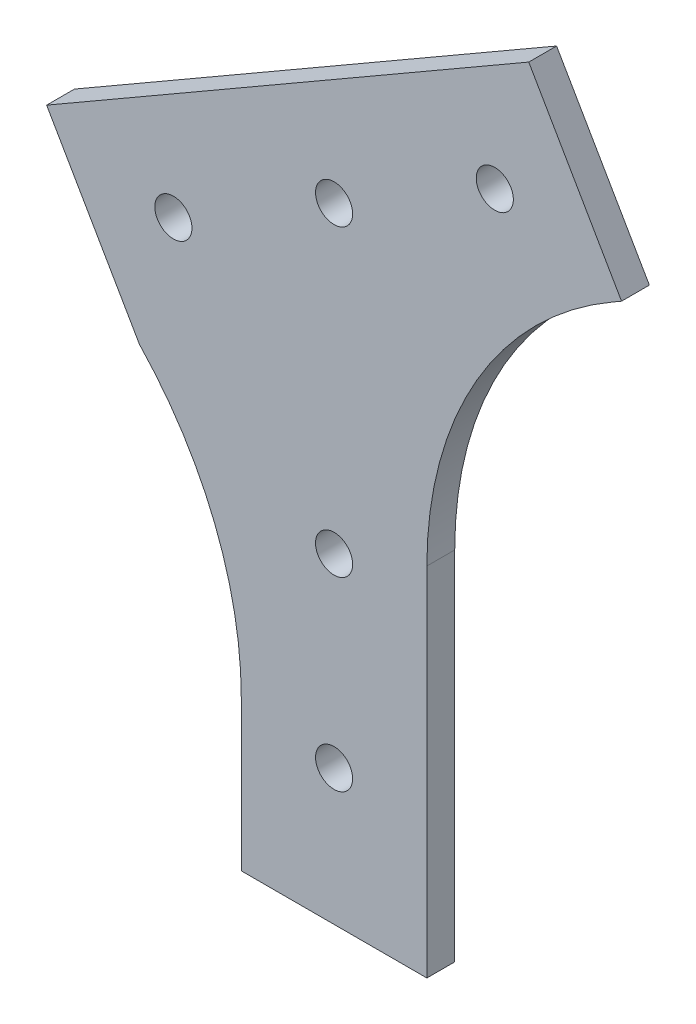
ISO-10303-21;
HEADER;
FILE_DESCRIPTION(('STEP AP214'),'2;1');
FILE_NAME('part.step','',(''),(''),'','','');
FILE_SCHEMA(('AUTOMOTIVE_DESIGN { 1 0 10303 214 1 1 1 1 }'));
ENDSEC;
DATA;
#1=APPLICATION_CONTEXT('core data for automotive mechanical design processes');
#2=APPLICATION_PROTOCOL_DEFINITION('international standard','automotive_design',2000,#1);
#3=PRODUCT_CONTEXT('',#1,'mechanical');
#4=PRODUCT('Part','Part','',(#3));
#5=PRODUCT_RELATED_PRODUCT_CATEGORY('part','',(#4));
#6=PRODUCT_DEFINITION_FORMATION('','',#4);
#7=PRODUCT_DEFINITION_CONTEXT('part definition',#1,'design');
#8=PRODUCT_DEFINITION('design','',#6,#7);
#9=PRODUCT_DEFINITION_SHAPE('','',#8);
#10=(LENGTH_UNIT() NAMED_UNIT(*) SI_UNIT(.MILLI.,.METRE.));
#11=(NAMED_UNIT(*) PLANE_ANGLE_UNIT() SI_UNIT($,.RADIAN.));
#12=(NAMED_UNIT(*) SI_UNIT($,.STERADIAN.) SOLID_ANGLE_UNIT());
#13=UNCERTAINTY_MEASURE_WITH_UNIT(LENGTH_MEASURE(1.E-05),#10,'distance_accuracy_value','');
#14=(GEOMETRIC_REPRESENTATION_CONTEXT(3) GLOBAL_UNCERTAINTY_ASSIGNED_CONTEXT((#13)) GLOBAL_UNIT_ASSIGNED_CONTEXT((#10,
#11,#12)) REPRESENTATION_CONTEXT('',''));
#15=CARTESIAN_POINT('',(0.,0.,0.));
#16=DIRECTION('',(0.,0.,1.));
#17=DIRECTION('',(1.,0.,0.));
#18=AXIS2_PLACEMENT_3D('',#15,#16,#17);
#19=CARTESIAN_POINT('',(-10.,0.,3.));
#20=DIRECTION('',(1.,0.,0.));
#21=DIRECTION('',(0.,1.,0.));
#22=AXIS2_PLACEMENT_3D('',#19,#20,#21);
#23=PLANE('',#22);
#24=DIRECTION('',(0.,-1.,0.));
#25=VECTOR('',#24,1.);
#26=CARTESIAN_POINT('',(-10.,0.,3.));
#27=LINE('',#26,#25);
#28=CARTESIAN_POINT('',(-10.,-8.86943598018235,3.));
#29=VERTEX_POINT('',#28);
#30=CARTESIAN_POINT('',(-10.,-25.,3.));
#31=VERTEX_POINT('',#30);
#32=EDGE_CURVE('E120',#29,#31,#27,.T.);
#33=ORIENTED_EDGE('',*,*,#32,.F.);
#34=DIRECTION('',(0.,0.,-1.));
#35=VECTOR('',#34,1.);
#36=CARTESIAN_POINT('',(-10.,-8.86943598018235,3.));
#37=LINE('',#36,#35);
#38=CARTESIAN_POINT('',(-10.,-8.86943598018235,0.));
#39=VERTEX_POINT('',#38);
#40=EDGE_CURVE('E142',#29,#39,#37,.T.);
#41=ORIENTED_EDGE('',*,*,#40,.T.);
#42=DIRECTION('',(0.,-1.,0.));
#43=VECTOR('',#42,1.);
#44=CARTESIAN_POINT('',(-10.,0.,0.));
#45=LINE('',#44,#43);
#46=CARTESIAN_POINT('',(-10.,-25.,0.));
#47=VERTEX_POINT('',#46);
#48=EDGE_CURVE('E138',#39,#47,#45,.T.);
#49=ORIENTED_EDGE('',*,*,#48,.T.);
#50=DIRECTION('',(0.,0.,-1.));
#51=VECTOR('',#50,1.);
#52=CARTESIAN_POINT('',(-10.,-25.,3.));
#53=LINE('',#52,#51);
#54=EDGE_CURVE('E136',#31,#47,#53,.T.);
#55=ORIENTED_EDGE('',*,*,#54,.F.);
#56=EDGE_LOOP('',(#33,#41,#49,#55));
#57=FACE_BOUND('',#56,.T.);
#58=ADVANCED_FACE('F49',(#57),#23,.F.);
#59=CARTESIAN_POINT('',(0.,-25.,3.));
#60=DIRECTION('',(0.,1.,0.));
#61=DIRECTION('',(0.,0.,1.));
#62=AXIS2_PLACEMENT_3D('',#59,#60,#61);
#63=PLANE('',#62);
#64=DIRECTION('',(1.,0.,0.));
#65=VECTOR('',#64,1.);
#66=CARTESIAN_POINT('',(0.,-25.,0.));
#67=LINE('',#66,#65);
#68=CARTESIAN_POINT('',(10.,-25.,0.));
#69=VERTEX_POINT('',#68);
#70=EDGE_CURVE('E186',#47,#69,#67,.T.);
#71=ORIENTED_EDGE('',*,*,#70,.T.);
#72=DIRECTION('',(0.,0.,-1.));
#73=VECTOR('',#72,1.);
#74=CARTESIAN_POINT('',(10.,-25.,3.));
#75=LINE('',#74,#73);
#76=CARTESIAN_POINT('',(10.,-25.,3.));
#77=VERTEX_POINT('',#76);
#78=EDGE_CURVE('E143',#77,#69,#75,.T.);
#79=ORIENTED_EDGE('',*,*,#78,.F.);
#80=DIRECTION('',(1.,0.,0.));
#81=VECTOR('',#80,1.);
#82=CARTESIAN_POINT('',(0.,-25.,3.));
#83=LINE('',#82,#81);
#84=EDGE_CURVE('E125',#31,#77,#83,.T.);
#85=ORIENTED_EDGE('',*,*,#84,.F.);
#86=ORIENTED_EDGE('',*,*,#54,.T.);
#87=EDGE_LOOP('',(#71,#79,#85,#86));
#88=FACE_BOUND('',#87,.T.);
#89=ADVANCED_FACE('F145',(#88),#63,.F.);
#90=CARTESIAN_POINT('',(9.99999999999999,0.,3.));
#91=DIRECTION('',(-1.,0.,0.));
#92=DIRECTION('',(0.,-1.,0.));
#93=AXIS2_PLACEMENT_3D('',#90,#91,#92);
#94=PLANE('',#93);
#95=DIRECTION('',(0.,1.,0.));
#96=VECTOR('',#95,1.);
#97=CARTESIAN_POINT('',(9.99999999999999,0.,0.));
#98=LINE('',#97,#96);
#99=CARTESIAN_POINT('',(9.99999999999999,13.4529946162077,0.));
#100=VERTEX_POINT('',#99);
#101=EDGE_CURVE('E183',#69,#100,#98,.T.);
#102=ORIENTED_EDGE('',*,*,#101,.T.);
#103=DIRECTION('',(0.,0.,-1.));
#104=VECTOR('',#103,1.);
#105=CARTESIAN_POINT('',(9.99999999999999,13.4529946162077,3.));
#106=LINE('',#105,#104);
#107=CARTESIAN_POINT('',(9.99999999999999,13.4529946162077,3.));
#108=VERTEX_POINT('',#107);
#109=EDGE_CURVE('E65',#100,#108,#106,.F.);
#110=ORIENTED_EDGE('',*,*,#109,.T.);
#111=DIRECTION('',(0.,1.,0.));
#112=VECTOR('',#111,1.);
#113=CARTESIAN_POINT('',(9.99999999999999,0.,3.));
#114=LINE('',#113,#112);
#115=EDGE_CURVE('E148',#77,#108,#114,.T.);
#116=ORIENTED_EDGE('',*,*,#115,.F.);
#117=ORIENTED_EDGE('',*,*,#78,.T.);
#118=EDGE_LOOP('',(#102,#110,#116,#117));
#119=FACE_BOUND('',#118,.T.);
#120=ADVANCED_FACE('F300',(#119),#94,.F.);
#121=CARTESIAN_POINT('',(-13.3253175473056,23.0801270189221,3.));
#122=DIRECTION('',(-0.500000000000004,0.866025403784436,0.));
#123=DIRECTION('',(-0.866025403784436,-0.500000000000004,0.));
#124=AXIS2_PLACEMENT_3D('',#121,#122,#123);
#125=PLANE('',#124);
#126=DIRECTION('',(0.866025403784436,0.500000000000004,0.));
#127=VECTOR('',#126,1.);
#128=CARTESIAN_POINT('',(-13.3253175473056,23.0801270189221,3.));
#129=LINE('',#128,#127);
#130=CARTESIAN_POINT('',(29.9999999999998,48.0940107675852,3.));
#131=VERTEX_POINT('',#130);
#132=CARTESIAN_POINT('',(30.9807621135331,48.6602540378446,3.));
#133=VERTEX_POINT('',#132);
#134=EDGE_CURVE('E151',#131,#133,#129,.T.);
#135=ORIENTED_EDGE('',*,*,#134,.F.);
#136=DIRECTION('',(0.,0.,-1.));
#137=VECTOR('',#136,1.);
#138=CARTESIAN_POINT('',(29.9999999999998,48.0940107675852,0.));
#139=LINE('',#138,#137);
#140=CARTESIAN_POINT('',(29.9999999999998,48.0940107675852,0.));
#141=VERTEX_POINT('',#140);
#142=EDGE_CURVE('E231',#131,#141,#139,.T.);
#143=ORIENTED_EDGE('',*,*,#142,.T.);
#144=DIRECTION('',(0.866025403784436,0.500000000000004,0.));
#145=VECTOR('',#144,1.);
#146=CARTESIAN_POINT('',(-13.3253175473056,23.0801270189221,0.));
#147=LINE('',#146,#145);
#148=CARTESIAN_POINT('',(30.9807621135331,48.6602540378446,0.));
#149=VERTEX_POINT('',#148);
#150=EDGE_CURVE('E179',#141,#149,#147,.T.);
#151=ORIENTED_EDGE('',*,*,#150,.T.);
#152=DIRECTION('',(0.,0.,-1.));
#153=VECTOR('',#152,1.);
#154=CARTESIAN_POINT('',(30.9807621135331,48.6602540378446,3.));
#155=LINE('',#154,#153);
#156=EDGE_CURVE('E223',#133,#149,#155,.T.);
#157=ORIENTED_EDGE('',*,*,#156,.F.);
#158=EDGE_LOOP('',(#135,#143,#151,#157));
#159=FACE_BOUND('',#158,.T.);
#160=ADVANCED_FACE('F321',(#159),#125,.F.);
#161=CARTESIAN_POINT('',(44.3060796608387,25.5801270189225,3.));
#162=DIRECTION('',(0.866025403784436,0.500000000000004,0.));
#163=DIRECTION('',(-0.500000000000004,0.866025403784436,0.));
#164=AXIS2_PLACEMENT_3D('',#161,#162,#163);
#165=PLANE('',#164);
#166=DIRECTION('',(0.500000000000004,-0.866025403784436,0.));
#167=VECTOR('',#166,1.);
#168=CARTESIAN_POINT('',(44.3060796608387,25.5801270189225,0.));
#169=LINE('',#168,#167);
#170=CARTESIAN_POINT('',(20.980762113533,65.9807621135334,0.));
#171=VERTEX_POINT('',#170);
#172=EDGE_CURVE('E182',#171,#149,#169,.T.);
#173=ORIENTED_EDGE('',*,*,#172,.F.);
#174=DIRECTION('',(0.,0.,-1.));
#175=VECTOR('',#174,1.);
#176=CARTESIAN_POINT('',(20.980762113533,65.9807621135334,3.));
#177=LINE('',#176,#175);
#178=CARTESIAN_POINT('',(20.980762113533,65.9807621135334,3.));
#179=VERTEX_POINT('',#178);
#180=EDGE_CURVE('E220',#179,#171,#177,.T.);
#181=ORIENTED_EDGE('',*,*,#180,.F.);
#182=DIRECTION('',(0.500000000000004,-0.866025403784436,0.));
#183=VECTOR('',#182,1.);
#184=CARTESIAN_POINT('',(44.3060796608387,25.5801270189225,3.));
#185=LINE('',#184,#183);
#186=EDGE_CURVE('E155',#179,#133,#185,.T.);
#187=ORIENTED_EDGE('',*,*,#186,.T.);
#188=ORIENTED_EDGE('',*,*,#156,.T.);
#189=EDGE_LOOP('',(#173,#181,#187,#188));
#190=FACE_BOUND('',#189,.T.);
#191=ADVANCED_FACE('F319',(#190),#165,.T.);
#192=CARTESIAN_POINT('',(-23.3253175473057,40.4006350946108,3.));
#193=DIRECTION('',(-0.500000000000005,0.866025403784436,0.));
#194=DIRECTION('',(-0.866025403784436,-0.500000000000005,0.));
#195=AXIS2_PLACEMENT_3D('',#192,#193,#194);
#196=PLANE('',#195);
#197=DIRECTION('',(0.866025403784436,0.500000000000005,0.));
#198=VECTOR('',#197,1.);
#199=CARTESIAN_POINT('',(-23.3253175473057,40.4006350946108,0.));
#200=LINE('',#199,#198);
#201=CARTESIAN_POINT('',(-30.9807621135331,35.9807621135331,0.));
#202=VERTEX_POINT('',#201);
#203=EDGE_CURVE('E195',#202,#171,#200,.T.);
#204=ORIENTED_EDGE('',*,*,#203,.F.);
#205=DIRECTION('',(0.,0.,-1.));
#206=VECTOR('',#205,1.);
#207=CARTESIAN_POINT('',(-30.9807621135331,35.9807621135331,3.));
#208=LINE('',#207,#206);
#209=CARTESIAN_POINT('',(-30.9807621135331,35.9807621135331,3.));
#210=VERTEX_POINT('',#209);
#211=EDGE_CURVE('E217',#210,#202,#208,.T.);
#212=ORIENTED_EDGE('',*,*,#211,.F.);
#213=DIRECTION('',(0.866025403784436,0.500000000000005,0.));
#214=VECTOR('',#213,1.);
#215=CARTESIAN_POINT('',(-23.3253175473057,40.4006350946108,3.));
#216=LINE('',#215,#214);
#217=EDGE_CURVE('E159',#210,#179,#216,.T.);
#218=ORIENTED_EDGE('',*,*,#217,.T.);
#219=ORIENTED_EDGE('',*,*,#180,.T.);
#220=EDGE_LOOP('',(#204,#212,#218,#219));
#221=FACE_BOUND('',#220,.T.);
#222=ADVANCED_FACE('F316',(#221),#196,.T.);
#223=CARTESIAN_POINT('',(17.3205080756887,52.3205080756889,3.));
#224=DIRECTION('',(0.,0.,-1.));
#225=DIRECTION('',(-1.,0.,0.));
#226=AXIS2_PLACEMENT_3D('',#223,#224,#225);
#227=CYLINDRICAL_SURFACE('',#226,2.00000000000001);
#228=CARTESIAN_POINT('',(17.3205080756887,52.3205080756889,3.));
#229=DIRECTION('',(0.,0.,1.));
#230=DIRECTION('',(1.,0.,0.));
#231=AXIS2_PLACEMENT_3D('',#228,#229,#230);
#232=CIRCLE('',#231,2.00000000000001);
#233=CARTESIAN_POINT('',(19.3205080756887,52.3205080756889,3.));
#234=VERTEX_POINT('',#233);
#235=EDGE_CURVE('E170',#234,#234,#232,.T.);
#236=ORIENTED_EDGE('',*,*,#235,.T.);
#237=EDGE_LOOP('',(#236));
#238=FACE_BOUND('',#237,.T.);
#239=CARTESIAN_POINT('',(17.3205080756887,52.3205080756889,0.));
#240=DIRECTION('',(0.,0.,1.));
#241=DIRECTION('',(1.,0.,0.));
#242=AXIS2_PLACEMENT_3D('',#239,#240,#241);
#243=CIRCLE('',#242,2.00000000000001);
#244=CARTESIAN_POINT('',(19.3205080756887,52.3205080756889,0.));
#245=VERTEX_POINT('',#244);
#246=EDGE_CURVE('E207',#245,#245,#243,.T.);
#247=ORIENTED_EDGE('',*,*,#246,.F.);
#248=EDGE_LOOP('',(#247));
#249=FACE_BOUND('',#248,.T.);
#250=ADVANCED_FACE('F332',(#238,#249),#227,.F.);
#251=CARTESIAN_POINT('',(0.,42.3205080756889,3.));
#252=DIRECTION('',(0.,0.,-1.));
#253=DIRECTION('',(-1.,0.,0.));
#254=AXIS2_PLACEMENT_3D('',#251,#252,#253);
#255=CYLINDRICAL_SURFACE('',#254,2.);
#256=CARTESIAN_POINT('',(0.,42.3205080756889,3.));
#257=DIRECTION('',(0.,0.,1.));
#258=DIRECTION('',(1.,0.,0.));
#259=AXIS2_PLACEMENT_3D('',#256,#257,#258);
#260=CIRCLE('',#259,2.);
#261=CARTESIAN_POINT('',(2.,42.3205080756889,3.));
#262=VERTEX_POINT('',#261);
#263=EDGE_CURVE('E166',#262,#262,#260,.T.);
#264=ORIENTED_EDGE('',*,*,#263,.T.);
#265=EDGE_LOOP('',(#264));
#266=FACE_BOUND('',#265,.T.);
#267=CARTESIAN_POINT('',(0.,42.3205080756889,0.));
#268=DIRECTION('',(0.,0.,1.));
#269=DIRECTION('',(1.,0.,0.));
#270=AXIS2_PLACEMENT_3D('',#267,#268,#269);
#271=CIRCLE('',#270,2.);
#272=CARTESIAN_POINT('',(2.,42.3205080756889,0.));
#273=VERTEX_POINT('',#272);
#274=EDGE_CURVE('E203',#273,#273,#271,.T.);
#275=ORIENTED_EDGE('',*,*,#274,.F.);
#276=EDGE_LOOP('',(#275));
#277=FACE_BOUND('',#276,.T.);
#278=ADVANCED_FACE('F291',(#266,#277),#255,.F.);
#279=CARTESIAN_POINT('',(-7.65544456622747,-4.41987298107773,3.));
#280=DIRECTION('',(0.866025403784436,0.500000000000004,0.));
#281=DIRECTION('',(-0.500000000000004,0.866025403784436,0.));
#282=AXIS2_PLACEMENT_3D('',#279,#280,#281);
#283=PLANE('',#282);
#284=DIRECTION('',(0.500000000000004,-0.866025403784436,0.));
#285=VECTOR('',#284,1.);
#286=CARTESIAN_POINT('',(-7.65544456622747,-4.41987298107773,0.));
#287=LINE('',#286,#285);
#288=CARTESIAN_POINT('',(-20.980762113533,18.6602540378444,0.));
#289=VERTEX_POINT('',#288);
#290=EDGE_CURVE('E199',#202,#289,#287,.T.);
#291=ORIENTED_EDGE('',*,*,#290,.T.);
#292=DIRECTION('',(0.,0.,-1.));
#293=VECTOR('',#292,1.);
#294=CARTESIAN_POINT('',(-20.980762113533,18.6602540378444,3.));
#295=LINE('',#294,#293);
#296=CARTESIAN_POINT('',(-20.980762113533,18.6602540378444,3.));
#297=VERTEX_POINT('',#296);
#298=EDGE_CURVE('E178',#297,#289,#295,.T.);
#299=ORIENTED_EDGE('',*,*,#298,.F.);
#300=DIRECTION('',(0.500000000000004,-0.866025403784436,0.));
#301=VECTOR('',#300,1.);
#302=CARTESIAN_POINT('',(-7.65544456622747,-4.41987298107773,3.));
#303=LINE('',#302,#301);
#304=EDGE_CURVE('E163',#210,#297,#303,.T.);
#305=ORIENTED_EDGE('',*,*,#304,.F.);
#306=ORIENTED_EDGE('',*,*,#211,.T.);
#307=EDGE_LOOP('',(#291,#299,#305,#306));
#308=FACE_BOUND('',#307,.T.);
#309=ADVANCED_FACE('F280',(#308),#283,.F.);
#310=CARTESIAN_POINT('',(-17.3205080756888,32.3205080756888,3.));
#311=DIRECTION('',(0.,0.,-1.));
#312=DIRECTION('',(-1.,0.,0.));
#313=AXIS2_PLACEMENT_3D('',#310,#311,#312);
#314=CYLINDRICAL_SURFACE('',#313,2.00000000000002);
#315=CARTESIAN_POINT('',(-17.3205080756888,32.3205080756888,3.));
#316=DIRECTION('',(0.,0.,1.));
#317=DIRECTION('',(1.,0.,0.));
#318=AXIS2_PLACEMENT_3D('',#315,#316,#317);
#319=CIRCLE('',#318,2.00000000000002);
#320=CARTESIAN_POINT('',(-15.3205080756887,32.3205080756888,3.));
#321=VERTEX_POINT('',#320);
#322=EDGE_CURVE('E174',#321,#321,#319,.T.);
#323=ORIENTED_EDGE('',*,*,#322,.T.);
#324=EDGE_LOOP('',(#323));
#325=FACE_BOUND('',#324,.T.);
#326=CARTESIAN_POINT('',(-17.3205080756888,32.3205080756888,0.));
#327=DIRECTION('',(0.,0.,1.));
#328=DIRECTION('',(1.,0.,0.));
#329=AXIS2_PLACEMENT_3D('',#326,#327,#328);
#330=CIRCLE('',#329,2.00000000000002);
#331=CARTESIAN_POINT('',(-15.3205080756887,32.3205080756888,0.));
#332=VERTEX_POINT('',#331);
#333=EDGE_CURVE('E133',#332,#332,#330,.T.);
#334=ORIENTED_EDGE('',*,*,#333,.F.);
#335=EDGE_LOOP('',(#334));
#336=FACE_BOUND('',#335,.T.);
#337=ADVANCED_FACE('F278',(#325,#336),#314,.F.);
#338=CARTESIAN_POINT('',(0.,0.,3.));
#339=DIRECTION('',(0.,0.,1.));
#340=DIRECTION('',(1.,0.,0.));
#341=AXIS2_PLACEMENT_3D('',#338,#339,#340);
#342=PLANE('',#341);
#343=CARTESIAN_POINT('',(0.,9.6018006685404,3.));
#344=DIRECTION('',(0.,0.,1.));
#345=DIRECTION('',(1.,0.,0.));
#346=AXIS2_PLACEMENT_3D('',#343,#344,#345);
#347=CIRCLE('',#346,2.);
#348=CARTESIAN_POINT('',(2.00000000000002,9.6018006685404,3.));
#349=VERTEX_POINT('',#348);
#350=EDGE_CURVE('E187',#349,#349,#347,.T.);
#351=ORIENTED_EDGE('',*,*,#350,.F.);
#352=EDGE_LOOP('',(#351));
#353=FACE_BOUND('',#352,.T.);
#354=CARTESIAN_POINT('',(0.,-10.3981993314596,3.));
#355=DIRECTION('',(0.,0.,1.));
#356=DIRECTION('',(1.,0.,0.));
#357=AXIS2_PLACEMENT_3D('',#354,#355,#356);
#358=CIRCLE('',#357,2.);
#359=CARTESIAN_POINT('',(2.00000000000002,-10.3981993314596,3.));
#360=VERTEX_POINT('',#359);
#361=EDGE_CURVE('E250',#360,#360,#358,.T.);
#362=ORIENTED_EDGE('',*,*,#361,.F.);
#363=EDGE_LOOP('',(#362));
#364=FACE_BOUND('',#363,.T.);
#365=ORIENTED_EDGE('',*,*,#304,.T.);
#366=CARTESIAN_POINT('',(-50.,-8.86943598018236,3.));
#367=DIRECTION('',(0.,0.,1.));
#368=DIRECTION('',(1.,0.,0.));
#369=AXIS2_PLACEMENT_3D('',#366,#367,#368);
#370=CIRCLE('',#369,40.);
#371=EDGE_CURVE('E128',#297,#29,#370,.F.);
#372=ORIENTED_EDGE('',*,*,#371,.T.);
#373=ORIENTED_EDGE('',*,*,#32,.T.);
#374=ORIENTED_EDGE('',*,*,#84,.T.);
#375=ORIENTED_EDGE('',*,*,#115,.T.);
#376=CARTESIAN_POINT('',(50.,13.4529946162077,3.));
#377=DIRECTION('',(0.,0.,1.));
#378=DIRECTION('',(1.,0.,0.));
#379=AXIS2_PLACEMENT_3D('',#376,#377,#378);
#380=CIRCLE('',#379,40.);
#381=EDGE_CURVE('E11',#108,#131,#380,.F.);
#382=ORIENTED_EDGE('',*,*,#381,.T.);
#383=ORIENTED_EDGE('',*,*,#134,.T.);
#384=ORIENTED_EDGE('',*,*,#186,.F.);
#385=ORIENTED_EDGE('',*,*,#217,.F.);
#386=EDGE_LOOP('',(#365,#372,#373,#374,#375,#382,#383,#384,#385));
#387=FACE_BOUND('',#386,.T.);
#388=ORIENTED_EDGE('',*,*,#263,.F.);
#389=EDGE_LOOP('',(#388));
#390=FACE_BOUND('',#389,.T.);
#391=ORIENTED_EDGE('',*,*,#235,.F.);
#392=EDGE_LOOP('',(#391));
#393=FACE_BOUND('',#392,.T.);
#394=ORIENTED_EDGE('',*,*,#322,.F.);
#395=EDGE_LOOP('',(#394));
#396=FACE_BOUND('',#395,.T.);
#397=ADVANCED_FACE('F122',(#353,#364,#387,#390,#393,#396),#342,.T.);
#398=CARTESIAN_POINT('',(0.,0.,0.));
#399=DIRECTION('',(0.,0.,1.));
#400=DIRECTION('',(1.,0.,0.));
#401=AXIS2_PLACEMENT_3D('',#398,#399,#400);
#402=PLANE('',#401);
#403=CARTESIAN_POINT('',(0.,9.6018006685404,0.));
#404=DIRECTION('',(0.,0.,-1.));
#405=DIRECTION('',(-1.,0.,0.));
#406=AXIS2_PLACEMENT_3D('',#403,#404,#405);
#407=CIRCLE('',#406,2.);
#408=CARTESIAN_POINT('',(-1.99999999999998,9.6018006685404,0.));
#409=VERTEX_POINT('',#408);
#410=EDGE_CURVE('E254',#409,#409,#407,.T.);
#411=ORIENTED_EDGE('',*,*,#410,.F.);
#412=EDGE_LOOP('',(#411));
#413=FACE_BOUND('',#412,.T.);
#414=CARTESIAN_POINT('',(0.,-10.3981993314596,0.));
#415=DIRECTION('',(0.,0.,-1.));
#416=DIRECTION('',(-1.,0.,0.));
#417=AXIS2_PLACEMENT_3D('',#414,#415,#416);
#418=CIRCLE('',#417,2.);
#419=CARTESIAN_POINT('',(-1.99999999999999,-10.3981993314596,0.));
#420=VERTEX_POINT('',#419);
#421=EDGE_CURVE('E255',#420,#420,#418,.T.);
#422=ORIENTED_EDGE('',*,*,#421,.F.);
#423=EDGE_LOOP('',(#422));
#424=FACE_BOUND('',#423,.T.);
#425=ORIENTED_EDGE('',*,*,#48,.F.);
#426=CARTESIAN_POINT('',(-50.,-8.86943598018236,0.));
#427=DIRECTION('',(0.,0.,1.));
#428=DIRECTION('',(1.,0.,0.));
#429=AXIS2_PLACEMENT_3D('',#426,#427,#428);
#430=CIRCLE('',#429,40.);
#431=EDGE_CURVE('E237',#39,#289,#430,.T.);
#432=ORIENTED_EDGE('',*,*,#431,.T.);
#433=ORIENTED_EDGE('',*,*,#290,.F.);
#434=ORIENTED_EDGE('',*,*,#203,.T.);
#435=ORIENTED_EDGE('',*,*,#172,.T.);
#436=ORIENTED_EDGE('',*,*,#150,.F.);
#437=CARTESIAN_POINT('',(50.,13.4529946162077,0.));
#438=DIRECTION('',(0.,0.,1.));
#439=DIRECTION('',(1.,0.,0.));
#440=AXIS2_PLACEMENT_3D('',#437,#438,#439);
#441=CIRCLE('',#440,40.);
#442=EDGE_CURVE('E58',#141,#100,#441,.T.);
#443=ORIENTED_EDGE('',*,*,#442,.T.);
#444=ORIENTED_EDGE('',*,*,#101,.F.);
#445=ORIENTED_EDGE('',*,*,#70,.F.);
#446=EDGE_LOOP('',(#425,#432,#433,#434,#435,#436,#443,#444,#445));
#447=FACE_BOUND('',#446,.T.);
#448=ORIENTED_EDGE('',*,*,#274,.T.);
#449=EDGE_LOOP('',(#448));
#450=FACE_BOUND('',#449,.T.);
#451=ORIENTED_EDGE('',*,*,#246,.T.);
#452=EDGE_LOOP('',(#451));
#453=FACE_BOUND('',#452,.T.);
#454=ORIENTED_EDGE('',*,*,#333,.T.);
#455=EDGE_LOOP('',(#454));
#456=FACE_BOUND('',#455,.T.);
#457=ADVANCED_FACE('F265',(#413,#424,#447,#450,#453,#456),#402,.F.);
#458=CARTESIAN_POINT('',(-50.,-8.86943598018236,3.));
#459=DIRECTION('',(0.,0.,-1.));
#460=DIRECTION('',(-1.,0.,0.));
#461=AXIS2_PLACEMENT_3D('',#458,#459,#460);
#462=CYLINDRICAL_SURFACE('',#461,40.);
#463=ORIENTED_EDGE('',*,*,#371,.F.);
#464=ORIENTED_EDGE('',*,*,#298,.T.);
#465=ORIENTED_EDGE('',*,*,#431,.F.);
#466=ORIENTED_EDGE('',*,*,#40,.F.);
#467=EDGE_LOOP('',(#463,#464,#465,#466));
#468=FACE_BOUND('',#467,.T.);
#469=ADVANCED_FACE('F268',(#468),#462,.F.);
#470=CARTESIAN_POINT('',(50.,13.4529946162077,3.));
#471=DIRECTION('',(0.,0.,1.));
#472=DIRECTION('',(1.,0.,0.));
#473=AXIS2_PLACEMENT_3D('',#470,#471,#472);
#474=CYLINDRICAL_SURFACE('',#473,40.);
#475=ORIENTED_EDGE('',*,*,#381,.F.);
#476=ORIENTED_EDGE('',*,*,#109,.F.);
#477=ORIENTED_EDGE('',*,*,#442,.F.);
#478=ORIENTED_EDGE('',*,*,#142,.F.);
#479=EDGE_LOOP('',(#475,#476,#477,#478));
#480=FACE_BOUND('',#479,.T.);
#481=ADVANCED_FACE('F51',(#480),#474,.F.);
#482=CARTESIAN_POINT('',(0.,-10.3981993314596,10.));
#483=DIRECTION('',(0.,0.,-1.));
#484=DIRECTION('',(-1.,0.,0.));
#485=AXIS2_PLACEMENT_3D('',#482,#483,#484);
#486=CYLINDRICAL_SURFACE('',#485,2.);
#487=ORIENTED_EDGE('',*,*,#361,.T.);
#488=EDGE_LOOP('',(#487));
#489=FACE_BOUND('',#488,.T.);
#490=ORIENTED_EDGE('',*,*,#421,.T.);
#491=EDGE_LOOP('',(#490));
#492=FACE_BOUND('',#491,.T.);
#493=ADVANCED_FACE('F308',(#489,#492),#486,.F.);
#494=CARTESIAN_POINT('',(0.,9.6018006685404,10.));
#495=DIRECTION('',(0.,0.,-1.));
#496=DIRECTION('',(-1.,0.,0.));
#497=AXIS2_PLACEMENT_3D('',#494,#495,#496);
#498=CYLINDRICAL_SURFACE('',#497,2.);
#499=ORIENTED_EDGE('',*,*,#350,.T.);
#500=EDGE_LOOP('',(#499));
#501=FACE_BOUND('',#500,.T.);
#502=ORIENTED_EDGE('',*,*,#410,.T.);
#503=EDGE_LOOP('',(#502));
#504=FACE_BOUND('',#503,.T.);
#505=ADVANCED_FACE('F263',(#501,#504),#498,.F.);
#506=CLOSED_SHELL('',(#58,#89,#120,#160,#191,#222,#250,#278,#309,#337,#397,#457,#469,#481,#493,#505));
#507=MANIFOLD_SOLID_BREP('B2',#506);
#508=ADVANCED_BREP_SHAPE_REPRESENTATION('',(#18,#507),#14);
#509=SHAPE_DEFINITION_REPRESENTATION(#9,#508);
ENDSEC;
END-ISO-10303-21;
